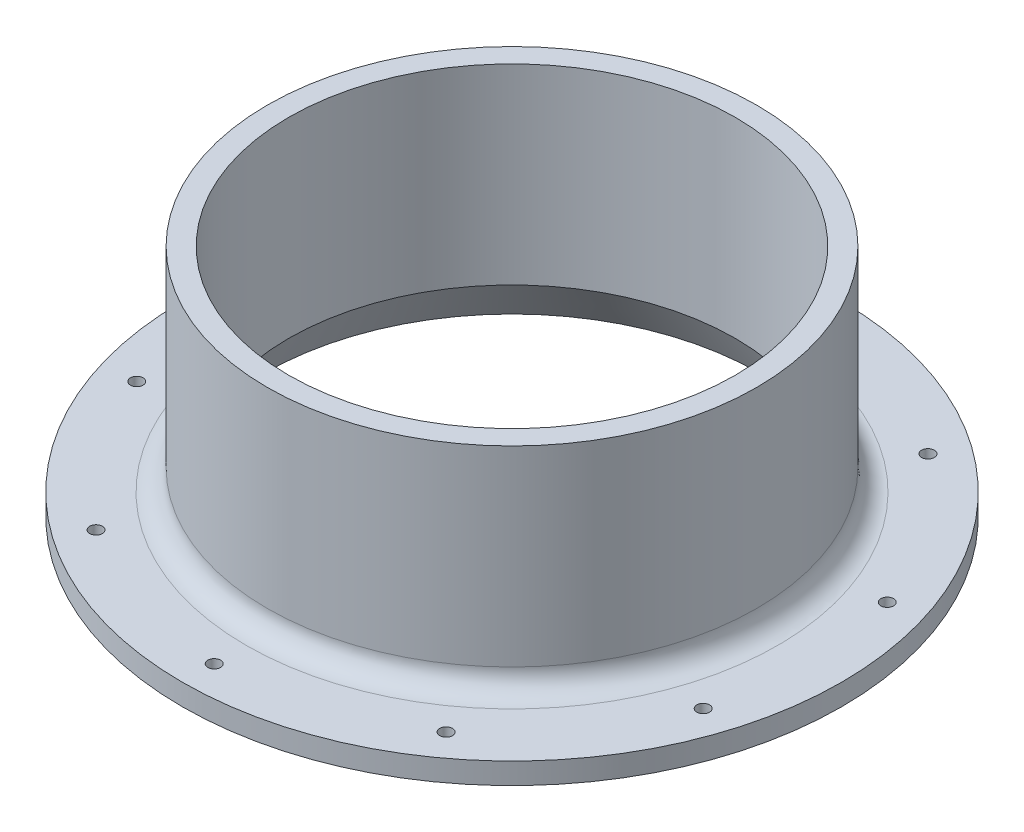
ISO-10303-21;
HEADER;
FILE_DESCRIPTION(('STEP AP214'),'2;1');
FILE_NAME('part.step','',(''),(''),'','','');
FILE_SCHEMA(('AUTOMOTIVE_DESIGN { 1 0 10303 214 1 1 1 1 }'));
ENDSEC;
DATA;
#1=APPLICATION_CONTEXT('core data for automotive mechanical design processes');
#2=APPLICATION_PROTOCOL_DEFINITION('international standard','automotive_design',2000,#1);
#3=PRODUCT_CONTEXT('',#1,'mechanical');
#4=PRODUCT('Part','Part','',(#3));
#5=PRODUCT_RELATED_PRODUCT_CATEGORY('part','',(#4));
#6=PRODUCT_DEFINITION_FORMATION('','',#4);
#7=PRODUCT_DEFINITION_CONTEXT('part definition',#1,'design');
#8=PRODUCT_DEFINITION('design','',#6,#7);
#9=PRODUCT_DEFINITION_SHAPE('','',#8);
#10=(LENGTH_UNIT() NAMED_UNIT(*) SI_UNIT(.MILLI.,.METRE.));
#11=(NAMED_UNIT(*) PLANE_ANGLE_UNIT() SI_UNIT($,.RADIAN.));
#12=(NAMED_UNIT(*) SI_UNIT($,.STERADIAN.) SOLID_ANGLE_UNIT());
#13=UNCERTAINTY_MEASURE_WITH_UNIT(LENGTH_MEASURE(1.E-05),#10,'distance_accuracy_value','');
#14=(GEOMETRIC_REPRESENTATION_CONTEXT(3) GLOBAL_UNCERTAINTY_ASSIGNED_CONTEXT((#13)) GLOBAL_UNIT_ASSIGNED_CONTEXT((#10,
#11,#12)) REPRESENTATION_CONTEXT('',''));
#15=CARTESIAN_POINT('',(0.,0.,0.));
#16=DIRECTION('',(0.,0.,1.));
#17=DIRECTION('',(1.,0.,0.));
#18=AXIS2_PLACEMENT_3D('',#15,#16,#17);
#19=CARTESIAN_POINT('',(0.,-6.35,0.));
#20=DIRECTION('',(0.,1.,0.));
#21=DIRECTION('',(0.,0.,1.));
#22=AXIS2_PLACEMENT_3D('',#19,#20,#21);
#23=CYLINDRICAL_SURFACE('',#22,98.425);
#24=CARTESIAN_POINT('',(0.,-6.35,0.));
#25=DIRECTION('',(0.,1.,0.));
#26=DIRECTION('',(0.,0.,1.));
#27=AXIS2_PLACEMENT_3D('',#24,#25,#26);
#28=CIRCLE('',#27,98.425);
#29=CARTESIAN_POINT('',(0.,-6.35,98.425));
#30=VERTEX_POINT('',#29);
#31=EDGE_CURVE('E123',#30,#30,#28,.T.);
#32=ORIENTED_EDGE('',*,*,#31,.T.);
#33=EDGE_LOOP('',(#32));
#34=FACE_BOUND('',#33,.T.);
#35=CARTESIAN_POINT('',(0.,0.,0.));
#36=DIRECTION('',(0.,1.,0.));
#37=DIRECTION('',(0.,0.,1.));
#38=AXIS2_PLACEMENT_3D('',#35,#36,#37);
#39=CIRCLE('',#38,98.425);
#40=CARTESIAN_POINT('',(0.,0.,98.425));
#41=VERTEX_POINT('',#40);
#42=EDGE_CURVE('E124',#41,#41,#39,.T.);
#43=ORIENTED_EDGE('',*,*,#42,.F.);
#44=EDGE_LOOP('',(#43));
#45=FACE_BOUND('',#44,.T.);
#46=ADVANCED_FACE('F42',(#34,#45),#23,.T.);
#47=CARTESIAN_POINT('',(0.,-6.35,0.));
#48=DIRECTION('',(0.,1.,0.));
#49=DIRECTION('',(0.,0.,1.));
#50=AXIS2_PLACEMENT_3D('',#47,#48,#49);
#51=CYLINDRICAL_SURFACE('',#50,66.675);
#52=CARTESIAN_POINT('',(0.,6.3500000000001,0.));
#53=DIRECTION('',(0.,1.,0.));
#54=DIRECTION('',(0.,0.,1.));
#55=AXIS2_PLACEMENT_3D('',#52,#53,#54);
#56=CIRCLE('',#55,66.675);
#57=CARTESIAN_POINT('',(0.,6.3500000000001,66.675));
#58=VERTEX_POINT('',#57);
#59=EDGE_CURVE('E10',#58,#58,#56,.F.);
#60=ORIENTED_EDGE('',*,*,#59,.T.);
#61=EDGE_LOOP('',(#60));
#62=FACE_BOUND('',#61,.T.);
#63=CARTESIAN_POINT('',(0.,63.5,0.));
#64=DIRECTION('',(0.,1.,0.));
#65=DIRECTION('',(0.,0.,1.));
#66=AXIS2_PLACEMENT_3D('',#63,#64,#65);
#67=CIRCLE('',#66,66.675);
#68=CARTESIAN_POINT('',(0.,63.5,66.675));
#69=VERTEX_POINT('',#68);
#70=EDGE_CURVE('E132',#69,#69,#67,.T.);
#71=ORIENTED_EDGE('',*,*,#70,.T.);
#72=EDGE_LOOP('',(#71));
#73=FACE_BOUND('',#72,.T.);
#74=ADVANCED_FACE('F184',(#62,#73),#51,.F.);
#75=CARTESIAN_POINT('',(0.,-6.35,0.));
#76=DIRECTION('',(0.,1.,0.));
#77=DIRECTION('',(0.,0.,1.));
#78=AXIS2_PLACEMENT_3D('',#75,#76,#77);
#79=PLANE('',#78);
#80=CARTESIAN_POINT('',(0.,-6.35,0.));
#81=DIRECTION('',(0.,1.,0.));
#82=DIRECTION('',(0.,0.,1.));
#83=AXIS2_PLACEMENT_3D('',#80,#81,#82);
#84=CIRCLE('',#83,74.0073484187082);
#85=CARTESIAN_POINT('',(0.,-6.35,74.0073484187082));
#86=VERTEX_POINT('',#85);
#87=EDGE_CURVE('E50',#86,#86,#84,.T.);
#88=ORIENTED_EDGE('',*,*,#87,.T.);
#89=EDGE_LOOP('',(#88));
#90=FACE_BOUND('',#89,.T.);
#91=CARTESIAN_POINT('',(52.2541089287999,-6.35,-71.9216107999335));
#92=DIRECTION('',(0.,1.,0.));
#93=DIRECTION('',(0.,0.,1.));
#94=AXIS2_PLACEMENT_3D('',#91,#92,#93);
#95=CIRCLE('',#94,3.93200000000001);
#96=CARTESIAN_POINT('',(52.2541089287999,-6.35,-67.9896107999335));
#97=VERTEX_POINT('',#96);
#98=EDGE_CURVE('E58',#97,#97,#95,.T.);
#99=ORIENTED_EDGE('',*,*,#98,.T.);
#100=EDGE_LOOP('',(#99));
#101=FACE_BOUND('',#100,.T.);
#102=CARTESIAN_POINT('',(84.5489242986388,-6.35,-27.4716107999338));
#103=DIRECTION('',(0.,1.,0.));
#104=DIRECTION('',(0.,0.,1.));
#105=AXIS2_PLACEMENT_3D('',#102,#103,#104);
#106=CIRCLE('',#105,3.93200000000003);
#107=CARTESIAN_POINT('',(84.5489242986388,-6.35,-23.5396107999337));
#108=VERTEX_POINT('',#107);
#109=EDGE_CURVE('E66',#108,#108,#106,.T.);
#110=ORIENTED_EDGE('',*,*,#109,.T.);
#111=EDGE_LOOP('',(#110));
#112=FACE_BOUND('',#111,.T.);
#113=CARTESIAN_POINT('',(84.5489242986394,-6.35,27.471610799932));
#114=DIRECTION('',(0.,1.,0.));
#115=DIRECTION('',(0.,0.,1.));
#116=AXIS2_PLACEMENT_3D('',#113,#114,#115);
#117=CIRCLE('',#116,3.93200000000004);
#118=CARTESIAN_POINT('',(84.5489242986394,-6.35,31.403610799932));
#119=VERTEX_POINT('',#118);
#120=EDGE_CURVE('E72',#119,#119,#117,.T.);
#121=ORIENTED_EDGE('',*,*,#120,.T.);
#122=EDGE_LOOP('',(#121));
#123=FACE_BOUND('',#122,.T.);
#124=CARTESIAN_POINT('',(52.2541089288015,-6.35,71.9216107999324));
#125=DIRECTION('',(0.,1.,0.));
#126=DIRECTION('',(0.,0.,1.));
#127=AXIS2_PLACEMENT_3D('',#124,#125,#126);
#128=CIRCLE('',#127,3.93200000000007);
#129=CARTESIAN_POINT('',(52.2541089288015,-6.35,75.8536107999324));
#130=VERTEX_POINT('',#129);
#131=EDGE_CURVE('E78',#130,#130,#128,.T.);
#132=ORIENTED_EDGE('',*,*,#131,.T.);
#133=EDGE_LOOP('',(#132));
#134=FACE_BOUND('',#133,.T.);
#135=CARTESIAN_POINT('',(0.,-6.35,88.9));
#136=DIRECTION('',(0.,1.,0.));
#137=DIRECTION('',(0.,0.,1.));
#138=AXIS2_PLACEMENT_3D('',#135,#136,#137);
#139=CIRCLE('',#138,3.93199999999999);
#140=CARTESIAN_POINT('',(0.,-6.35,92.832));
#141=VERTEX_POINT('',#140);
#142=EDGE_CURVE('E84',#141,#141,#139,.T.);
#143=ORIENTED_EDGE('',*,*,#142,.T.);
#144=EDGE_LOOP('',(#143));
#145=FACE_BOUND('',#144,.T.);
#146=CARTESIAN_POINT('',(-52.2541089288004,-6.35,71.9216107999331));
#147=DIRECTION('',(0.,1.,0.));
#148=DIRECTION('',(0.,0.,1.));
#149=AXIS2_PLACEMENT_3D('',#146,#147,#148);
#150=CIRCLE('',#149,3.932);
#151=CARTESIAN_POINT('',(-52.2541089288004,-6.35,75.8536107999331));
#152=VERTEX_POINT('',#151);
#153=EDGE_CURVE('E90',#152,#152,#150,.T.);
#154=ORIENTED_EDGE('',*,*,#153,.T.);
#155=EDGE_LOOP('',(#154));
#156=FACE_BOUND('',#155,.T.);
#157=CARTESIAN_POINT('',(-84.548924298639,-6.35,27.4716107999332));
#158=DIRECTION('',(0.,1.,0.));
#159=DIRECTION('',(0.,0.,1.));
#160=AXIS2_PLACEMENT_3D('',#157,#158,#159);
#161=CIRCLE('',#160,3.93200000000008);
#162=CARTESIAN_POINT('',(-84.548924298639,-6.35,31.4036107999333));
#163=VERTEX_POINT('',#162);
#164=EDGE_CURVE('E96',#163,#163,#161,.T.);
#165=ORIENTED_EDGE('',*,*,#164,.T.);
#166=EDGE_LOOP('',(#165));
#167=FACE_BOUND('',#166,.T.);
#168=CARTESIAN_POINT('',(-84.5489242986392,-6.35,-27.4716107999326));
#169=DIRECTION('',(0.,1.,0.));
#170=DIRECTION('',(0.,0.,1.));
#171=AXIS2_PLACEMENT_3D('',#168,#169,#170);
#172=CIRCLE('',#171,3.93200000000004);
#173=CARTESIAN_POINT('',(-84.5489242986392,-6.35,-23.5396107999325));
#174=VERTEX_POINT('',#173);
#175=EDGE_CURVE('E102',#174,#174,#172,.T.);
#176=ORIENTED_EDGE('',*,*,#175,.T.);
#177=EDGE_LOOP('',(#176));
#178=FACE_BOUND('',#177,.T.);
#179=CARTESIAN_POINT('',(-52.254108928801,-6.35,-71.9216107999328));
#180=DIRECTION('',(0.,1.,0.));
#181=DIRECTION('',(0.,0.,1.));
#182=AXIS2_PLACEMENT_3D('',#179,#180,#181);
#183=CIRCLE('',#182,3.93200000000003);
#184=CARTESIAN_POINT('',(-52.254108928801,-6.35,-67.9896107999327));
#185=VERTEX_POINT('',#184);
#186=EDGE_CURVE('E108',#185,#185,#183,.T.);
#187=ORIENTED_EDGE('',*,*,#186,.T.);
#188=EDGE_LOOP('',(#187));
#189=FACE_BOUND('',#188,.T.);
#190=CARTESIAN_POINT('',(0.,-6.35,-88.9));
#191=DIRECTION('',(0.,1.,0.));
#192=DIRECTION('',(0.,0.,1.));
#193=AXIS2_PLACEMENT_3D('',#190,#191,#192);
#194=CIRCLE('',#193,3.93199999999999);
#195=CARTESIAN_POINT('',(0.,-6.35,-84.968));
#196=VERTEX_POINT('',#195);
#197=EDGE_CURVE('E114',#196,#196,#194,.T.);
#198=ORIENTED_EDGE('',*,*,#197,.T.);
#199=EDGE_LOOP('',(#198));
#200=FACE_BOUND('',#199,.T.);
#201=ORIENTED_EDGE('',*,*,#31,.F.);
#202=EDGE_LOOP('',(#201));
#203=FACE_BOUND('',#202,.T.);
#204=ADVANCED_FACE('F172',(#90,#101,#112,#123,#134,#145,#156,#167,#178,#189,#200,#203),#79,.F.);
#205=CARTESIAN_POINT('',(0.,0.,0.));
#206=DIRECTION('',(0.,1.,0.));
#207=DIRECTION('',(0.,0.,1.));
#208=AXIS2_PLACEMENT_3D('',#205,#206,#207);
#209=PLANE('',#208);
#210=CARTESIAN_POINT('',(52.2541089287999,0.,-71.9216107999335));
#211=DIRECTION('',(0.,1.,0.));
#212=DIRECTION('',(-0.587785252292462,0.,0.809016994374955));
#213=AXIS2_PLACEMENT_3D('',#210,#211,#212);
#214=CIRCLE('',#213,1.9);
#215=CARTESIAN_POINT('',(51.1373169494442,0.,-70.3844785106211));
#216=VERTEX_POINT('',#215);
#217=EDGE_CURVE('E142',#216,#216,#214,.T.);
#218=ORIENTED_EDGE('',*,*,#217,.F.);
#219=EDGE_LOOP('',(#218));
#220=FACE_BOUND('',#219,.T.);
#221=CARTESIAN_POINT('',(84.5489242986388,0.,-27.4716107999338));
#222=DIRECTION('',(0.,1.,0.));
#223=DIRECTION('',(-0.95105651629515,0.,0.309016994374958));
#224=AXIS2_PLACEMENT_3D('',#221,#222,#223);
#225=CIRCLE('',#224,1.9);
#226=CARTESIAN_POINT('',(82.741916917678,0.,-26.8844785106214));
#227=VERTEX_POINT('',#226);
#228=EDGE_CURVE('E145',#227,#227,#225,.T.);
#229=ORIENTED_EDGE('',*,*,#228,.F.);
#230=EDGE_LOOP('',(#229));
#231=FACE_BOUND('',#230,.T.);
#232=CARTESIAN_POINT('',(84.5489242986394,0.,27.471610799932));
#233=DIRECTION('',(0.,1.,0.));
#234=DIRECTION('',(-0.951056516295157,0.,-0.309016994374938));
#235=AXIS2_PLACEMENT_3D('',#232,#233,#234);
#236=CIRCLE('',#235,1.9);
#237=CARTESIAN_POINT('',(82.7419169176786,0.,26.8844785106196));
#238=VERTEX_POINT('',#237);
#239=EDGE_CURVE('E148',#238,#238,#236,.T.);
#240=ORIENTED_EDGE('',*,*,#239,.F.);
#241=EDGE_LOOP('',(#240));
#242=FACE_BOUND('',#241,.T.);
#243=CARTESIAN_POINT('',(52.2541089288015,0.,71.9216107999324));
#244=DIRECTION('',(0.,1.,0.));
#245=DIRECTION('',(-0.58778525229248,0.,-0.809016994374942));
#246=AXIS2_PLACEMENT_3D('',#243,#244,#245);
#247=CIRCLE('',#246,1.9);
#248=CARTESIAN_POINT('',(51.1373169494458,0.,70.38447851062));
#249=VERTEX_POINT('',#248);
#250=EDGE_CURVE('E151',#249,#249,#247,.T.);
#251=ORIENTED_EDGE('',*,*,#250,.F.);
#252=EDGE_LOOP('',(#251));
#253=FACE_BOUND('',#252,.T.);
#254=CARTESIAN_POINT('',(0.,0.,88.9));
#255=DIRECTION('',(0.,1.,0.));
#256=DIRECTION('',(0.,0.,-1.));
#257=AXIS2_PLACEMENT_3D('',#254,#255,#256);
#258=CIRCLE('',#257,1.9);
#259=CARTESIAN_POINT('',(0.,0.,87.));
#260=VERTEX_POINT('',#259);
#261=EDGE_CURVE('E154',#260,#260,#258,.T.);
#262=ORIENTED_EDGE('',*,*,#261,.F.);
#263=EDGE_LOOP('',(#262));
#264=FACE_BOUND('',#263,.T.);
#265=CARTESIAN_POINT('',(-52.2541089288004,0.,71.9216107999331));
#266=DIRECTION('',(0.,1.,0.));
#267=DIRECTION('',(0.587785252292469,0.,-0.809016994374951));
#268=AXIS2_PLACEMENT_3D('',#265,#266,#267);
#269=CIRCLE('',#268,1.9);
#270=CARTESIAN_POINT('',(-51.1373169494448,0.,70.3844785106207));
#271=VERTEX_POINT('',#270);
#272=EDGE_CURVE('E157',#271,#271,#269,.T.);
#273=ORIENTED_EDGE('',*,*,#272,.F.);
#274=EDGE_LOOP('',(#273));
#275=FACE_BOUND('',#274,.T.);
#276=CARTESIAN_POINT('',(-84.548924298639,0.,27.4716107999332));
#277=DIRECTION('',(0.,1.,0.));
#278=DIRECTION('',(0.951056516295152,0.,-0.309016994374952));
#279=AXIS2_PLACEMENT_3D('',#276,#277,#278);
#280=CIRCLE('',#279,1.9);
#281=CARTESIAN_POINT('',(-82.7419169176782,0.,26.8844785106208));
#282=VERTEX_POINT('',#281);
#283=EDGE_CURVE('E160',#282,#282,#280,.T.);
#284=ORIENTED_EDGE('',*,*,#283,.F.);
#285=EDGE_LOOP('',(#284));
#286=FACE_BOUND('',#285,.T.);
#287=CARTESIAN_POINT('',(-84.5489242986392,0.,-27.4716107999326));
#288=DIRECTION('',(0.,1.,0.));
#289=DIRECTION('',(0.951056516295155,0.,0.309016994374945));
#290=AXIS2_PLACEMENT_3D('',#287,#288,#289);
#291=CIRCLE('',#290,1.9);
#292=CARTESIAN_POINT('',(-82.7419169176784,0.,-26.8844785106202));
#293=VERTEX_POINT('',#292);
#294=EDGE_CURVE('E141',#293,#293,#291,.T.);
#295=ORIENTED_EDGE('',*,*,#294,.F.);
#296=EDGE_LOOP('',(#295));
#297=FACE_BOUND('',#296,.T.);
#298=CARTESIAN_POINT('',(-52.254108928801,0.,-71.9216107999328));
#299=DIRECTION('',(0.,1.,0.));
#300=DIRECTION('',(0.587785252292474,0.,0.809016994374947));
#301=AXIS2_PLACEMENT_3D('',#298,#299,#300);
#302=CIRCLE('',#301,1.9);
#303=CARTESIAN_POINT('',(-51.1373169494453,0.,-70.3844785106204));
#304=VERTEX_POINT('',#303);
#305=EDGE_CURVE('E138',#304,#304,#302,.T.);
#306=ORIENTED_EDGE('',*,*,#305,.F.);
#307=EDGE_LOOP('',(#306));
#308=FACE_BOUND('',#307,.T.);
#309=CARTESIAN_POINT('',(0.,0.,-88.9));
#310=DIRECTION('',(0.,1.,0.));
#311=DIRECTION('',(0.,0.,1.));
#312=AXIS2_PLACEMENT_3D('',#309,#310,#311);
#313=CIRCLE('',#312,1.9);
#314=CARTESIAN_POINT('',(0.,0.,-87.));
#315=VERTEX_POINT('',#314);
#316=EDGE_CURVE('E135',#315,#315,#313,.T.);
#317=ORIENTED_EDGE('',*,*,#316,.F.);
#318=EDGE_LOOP('',(#317));
#319=FACE_BOUND('',#318,.T.);
#320=CARTESIAN_POINT('',(0.,0.,0.));
#321=DIRECTION('',(0.,1.,0.));
#322=DIRECTION('',(0.,0.,1.));
#323=AXIS2_PLACEMENT_3D('',#320,#321,#322);
#324=CIRCLE('',#323,79.375);
#325=CARTESIAN_POINT('',(0.,0.,79.375));
#326=VERTEX_POINT('',#325);
#327=EDGE_CURVE('E117',#326,#326,#324,.F.);
#328=ORIENTED_EDGE('',*,*,#327,.T.);
#329=EDGE_LOOP('',(#328));
#330=FACE_BOUND('',#329,.T.);
#331=ORIENTED_EDGE('',*,*,#42,.T.);
#332=EDGE_LOOP('',(#331));
#333=FACE_BOUND('',#332,.T.);
#334=ADVANCED_FACE('F168',(#220,#231,#242,#253,#264,#275,#286,#297,#308,#319,#330,#333),#209,.T.);
#335=CARTESIAN_POINT('',(0.,63.5,0.));
#336=DIRECTION('',(0.,-1.,0.));
#337=DIRECTION('',(0.,0.,-1.));
#338=AXIS2_PLACEMENT_3D('',#335,#336,#337);
#339=CYLINDRICAL_SURFACE('',#338,73.025);
#340=CARTESIAN_POINT('',(0.,6.35,0.));
#341=DIRECTION('',(0.,1.,0.));
#342=DIRECTION('',(0.,0.,1.));
#343=AXIS2_PLACEMENT_3D('',#340,#341,#342);
#344=CIRCLE('',#343,73.025);
#345=CARTESIAN_POINT('',(0.,6.35,73.025));
#346=VERTEX_POINT('',#345);
#347=EDGE_CURVE('E120',#346,#346,#344,.T.);
#348=ORIENTED_EDGE('',*,*,#347,.T.);
#349=EDGE_LOOP('',(#348));
#350=FACE_BOUND('',#349,.T.);
#351=CARTESIAN_POINT('',(0.,63.5,0.));
#352=DIRECTION('',(0.,1.,0.));
#353=DIRECTION('',(0.,0.,1.));
#354=AXIS2_PLACEMENT_3D('',#351,#352,#353);
#355=CIRCLE('',#354,73.025);
#356=CARTESIAN_POINT('',(0.,63.5,73.025));
#357=VERTEX_POINT('',#356);
#358=EDGE_CURVE('E127',#357,#357,#355,.T.);
#359=ORIENTED_EDGE('',*,*,#358,.F.);
#360=EDGE_LOOP('',(#359));
#361=FACE_BOUND('',#360,.T.);
#362=ADVANCED_FACE('F171',(#350,#361),#339,.T.);
#363=CARTESIAN_POINT('',(0.,63.5,0.));
#364=DIRECTION('',(0.,1.,0.));
#365=DIRECTION('',(0.,0.,1.));
#366=AXIS2_PLACEMENT_3D('',#363,#364,#365);
#367=PLANE('',#366);
#368=ORIENTED_EDGE('',*,*,#70,.F.);
#369=EDGE_LOOP('',(#368));
#370=FACE_BOUND('',#369,.T.);
#371=ORIENTED_EDGE('',*,*,#358,.T.);
#372=EDGE_LOOP('',(#371));
#373=FACE_BOUND('',#372,.T.);
#374=ADVANCED_FACE('F196',(#370,#373),#367,.T.);
#375=CARTESIAN_POINT('',(0.,6.35,0.));
#376=DIRECTION('',(0.,1.,0.));
#377=DIRECTION('',(0.,0.,1.));
#378=AXIS2_PLACEMENT_3D('',#375,#376,#377);
#379=TOROIDAL_SURFACE('',#378,79.375,6.35);
#380=ORIENTED_EDGE('',*,*,#327,.F.);
#381=EDGE_LOOP('',(#380));
#382=FACE_BOUND('',#381,.T.);
#383=ORIENTED_EDGE('',*,*,#347,.F.);
#384=EDGE_LOOP('',(#383));
#385=FACE_BOUND('',#384,.T.);
#386=ADVANCED_FACE('F192',(#382,#385),#379,.F.);
#387=CARTESIAN_POINT('',(0.,-6.35,-88.9));
#388=DIRECTION('',(0.,1.,0.));
#389=DIRECTION('',(0.,0.,1.));
#390=AXIS2_PLACEMENT_3D('',#387,#388,#389);
#391=CYLINDRICAL_SURFACE('',#390,1.9);
#392=CARTESIAN_POINT('',(0.,-4.31799999999997,-88.9));
#393=DIRECTION('',(0.,1.,0.));
#394=DIRECTION('',(0.,0.,1.));
#395=AXIS2_PLACEMENT_3D('',#392,#393,#394);
#396=CIRCLE('',#395,1.9);
#397=CARTESIAN_POINT('',(0.,-4.31799999999997,-87.));
#398=VERTEX_POINT('',#397);
#399=EDGE_CURVE('E111',#398,#398,#396,.F.);
#400=ORIENTED_EDGE('',*,*,#399,.T.);
#401=EDGE_LOOP('',(#400));
#402=FACE_BOUND('',#401,.T.);
#403=ORIENTED_EDGE('',*,*,#316,.T.);
#404=EDGE_LOOP('',(#403));
#405=FACE_BOUND('',#404,.T.);
#406=ADVANCED_FACE('F195',(#402,#405),#391,.F.);
#407=CARTESIAN_POINT('',(0.,-6.35,-88.9));
#408=DIRECTION('',(0.,-1.,0.));
#409=DIRECTION('',(0.,0.,-1.));
#410=AXIS2_PLACEMENT_3D('',#407,#408,#409);
#411=CONICAL_SURFACE('',#410,3.93199999999999,0.785398163397439);
#412=ORIENTED_EDGE('',*,*,#399,.F.);
#413=EDGE_LOOP('',(#412));
#414=FACE_BOUND('',#413,.T.);
#415=ORIENTED_EDGE('',*,*,#197,.F.);
#416=EDGE_LOOP('',(#415));
#417=FACE_BOUND('',#416,.T.);
#418=ADVANCED_FACE('F199',(#414,#417),#411,.F.);
#419=CARTESIAN_POINT('',(-52.254108928801,-6.35,-71.9216107999328));
#420=DIRECTION('',(0.,1.,0.));
#421=DIRECTION('',(0.,0.,1.));
#422=AXIS2_PLACEMENT_3D('',#419,#420,#421);
#423=CYLINDRICAL_SURFACE('',#422,1.9);
#424=CARTESIAN_POINT('',(-52.254108928801,-4.31799999999998,-71.9216107999328));
#425=DIRECTION('',(0.,1.,0.));
#426=DIRECTION('',(0.,0.,1.));
#427=AXIS2_PLACEMENT_3D('',#424,#425,#426);
#428=CIRCLE('',#427,1.9);
#429=CARTESIAN_POINT('',(-52.254108928801,-4.31799999999998,-70.0216107999328));
#430=VERTEX_POINT('',#429);
#431=EDGE_CURVE('E105',#430,#430,#428,.F.);
#432=ORIENTED_EDGE('',*,*,#431,.T.);
#433=EDGE_LOOP('',(#432));
#434=FACE_BOUND('',#433,.T.);
#435=ORIENTED_EDGE('',*,*,#305,.T.);
#436=EDGE_LOOP('',(#435));
#437=FACE_BOUND('',#436,.T.);
#438=ADVANCED_FACE('F205',(#434,#437),#423,.F.);
#439=CARTESIAN_POINT('',(-84.5489242986392,-6.35,-27.4716107999326));
#440=DIRECTION('',(0.,1.,0.));
#441=DIRECTION('',(0.,0.,1.));
#442=AXIS2_PLACEMENT_3D('',#439,#440,#441);
#443=CYLINDRICAL_SURFACE('',#442,1.9);
#444=CARTESIAN_POINT('',(-84.5489242986392,-4.31799999999998,-27.4716107999326));
#445=DIRECTION('',(0.,1.,0.));
#446=DIRECTION('',(0.,0.,1.));
#447=AXIS2_PLACEMENT_3D('',#444,#445,#446);
#448=CIRCLE('',#447,1.9);
#449=CARTESIAN_POINT('',(-84.5489242986392,-4.31799999999998,-25.5716107999326));
#450=VERTEX_POINT('',#449);
#451=EDGE_CURVE('E99',#450,#450,#448,.F.);
#452=ORIENTED_EDGE('',*,*,#451,.T.);
#453=EDGE_LOOP('',(#452));
#454=FACE_BOUND('',#453,.T.);
#455=ORIENTED_EDGE('',*,*,#294,.T.);
#456=EDGE_LOOP('',(#455));
#457=FACE_BOUND('',#456,.T.);
#458=ADVANCED_FACE('F166',(#454,#457),#443,.F.);
#459=CARTESIAN_POINT('',(-84.548924298639,-6.35,27.4716107999332));
#460=DIRECTION('',(0.,1.,0.));
#461=DIRECTION('',(0.,0.,1.));
#462=AXIS2_PLACEMENT_3D('',#459,#460,#461);
#463=CYLINDRICAL_SURFACE('',#462,1.9);
#464=CARTESIAN_POINT('',(-84.548924298639,-4.31799999999992,27.4716107999332));
#465=DIRECTION('',(0.,1.,0.));
#466=DIRECTION('',(0.,0.,1.));
#467=AXIS2_PLACEMENT_3D('',#464,#465,#466);
#468=CIRCLE('',#467,1.9);
#469=CARTESIAN_POINT('',(-84.548924298639,-4.31799999999992,29.3716107999332));
#470=VERTEX_POINT('',#469);
#471=EDGE_CURVE('E93',#470,#470,#468,.F.);
#472=ORIENTED_EDGE('',*,*,#471,.T.);
#473=EDGE_LOOP('',(#472));
#474=FACE_BOUND('',#473,.T.);
#475=ORIENTED_EDGE('',*,*,#283,.T.);
#476=EDGE_LOOP('',(#475));
#477=FACE_BOUND('',#476,.T.);
#478=ADVANCED_FACE('F344',(#474,#477),#463,.F.);
#479=CARTESIAN_POINT('',(-52.2541089288004,-6.35,71.9216107999331));
#480=DIRECTION('',(0.,1.,0.));
#481=DIRECTION('',(0.,0.,1.));
#482=AXIS2_PLACEMENT_3D('',#479,#480,#481);
#483=CYLINDRICAL_SURFACE('',#482,1.9);
#484=CARTESIAN_POINT('',(-52.2541089288004,-4.318,71.9216107999331));
#485=DIRECTION('',(0.,1.,0.));
#486=DIRECTION('',(0.,0.,1.));
#487=AXIS2_PLACEMENT_3D('',#484,#485,#486);
#488=CIRCLE('',#487,1.9);
#489=CARTESIAN_POINT('',(-52.2541089288004,-4.318,73.8216107999331));
#490=VERTEX_POINT('',#489);
#491=EDGE_CURVE('E87',#490,#490,#488,.F.);
#492=ORIENTED_EDGE('',*,*,#491,.T.);
#493=EDGE_LOOP('',(#492));
#494=FACE_BOUND('',#493,.T.);
#495=ORIENTED_EDGE('',*,*,#272,.T.);
#496=EDGE_LOOP('',(#495));
#497=FACE_BOUND('',#496,.T.);
#498=ADVANCED_FACE('F340',(#494,#497),#483,.F.);
#499=CARTESIAN_POINT('',(0.,-6.35,88.9));
#500=DIRECTION('',(0.,1.,0.));
#501=DIRECTION('',(0.,0.,1.));
#502=AXIS2_PLACEMENT_3D('',#499,#500,#501);
#503=CYLINDRICAL_SURFACE('',#502,1.9);
#504=CARTESIAN_POINT('',(0.,-4.31799999999997,88.9));
#505=DIRECTION('',(0.,1.,0.));
#506=DIRECTION('',(0.,0.,1.));
#507=AXIS2_PLACEMENT_3D('',#504,#505,#506);
#508=CIRCLE('',#507,1.9);
#509=CARTESIAN_POINT('',(0.,-4.31799999999997,90.8));
#510=VERTEX_POINT('',#509);
#511=EDGE_CURVE('E81',#510,#510,#508,.F.);
#512=ORIENTED_EDGE('',*,*,#511,.T.);
#513=EDGE_LOOP('',(#512));
#514=FACE_BOUND('',#513,.T.);
#515=ORIENTED_EDGE('',*,*,#261,.T.);
#516=EDGE_LOOP('',(#515));
#517=FACE_BOUND('',#516,.T.);
#518=ADVANCED_FACE('F336',(#514,#517),#503,.F.);
#519=CARTESIAN_POINT('',(52.2541089288015,-6.35,71.9216107999324));
#520=DIRECTION('',(0.,1.,0.));
#521=DIRECTION('',(0.,0.,1.));
#522=AXIS2_PLACEMENT_3D('',#519,#520,#521);
#523=CYLINDRICAL_SURFACE('',#522,1.9);
#524=CARTESIAN_POINT('',(52.2541089288015,-4.31799999999995,71.9216107999324));
#525=DIRECTION('',(0.,1.,0.));
#526=DIRECTION('',(0.,0.,1.));
#527=AXIS2_PLACEMENT_3D('',#524,#525,#526);
#528=CIRCLE('',#527,1.9);
#529=CARTESIAN_POINT('',(52.2541089288015,-4.31799999999995,73.8216107999324));
#530=VERTEX_POINT('',#529);
#531=EDGE_CURVE('E75',#530,#530,#528,.F.);
#532=ORIENTED_EDGE('',*,*,#531,.T.);
#533=EDGE_LOOP('',(#532));
#534=FACE_BOUND('',#533,.T.);
#535=ORIENTED_EDGE('',*,*,#250,.T.);
#536=EDGE_LOOP('',(#535));
#537=FACE_BOUND('',#536,.T.);
#538=ADVANCED_FACE('F332',(#534,#537),#523,.F.);
#539=CARTESIAN_POINT('',(84.5489242986394,-6.35,27.471610799932));
#540=DIRECTION('',(0.,1.,0.));
#541=DIRECTION('',(0.,0.,1.));
#542=AXIS2_PLACEMENT_3D('',#539,#540,#541);
#543=CYLINDRICAL_SURFACE('',#542,1.9);
#544=CARTESIAN_POINT('',(84.5489242986394,-4.31799999999994,27.471610799932));
#545=DIRECTION('',(0.,1.,0.));
#546=DIRECTION('',(0.,0.,1.));
#547=AXIS2_PLACEMENT_3D('',#544,#545,#546);
#548=CIRCLE('',#547,1.9);
#549=CARTESIAN_POINT('',(84.5489242986394,-4.31799999999994,29.371610799932));
#550=VERTEX_POINT('',#549);
#551=EDGE_CURVE('E69',#550,#550,#548,.F.);
#552=ORIENTED_EDGE('',*,*,#551,.T.);
#553=EDGE_LOOP('',(#552));
#554=FACE_BOUND('',#553,.T.);
#555=ORIENTED_EDGE('',*,*,#239,.T.);
#556=EDGE_LOOP('',(#555));
#557=FACE_BOUND('',#556,.T.);
#558=ADVANCED_FACE('F328',(#554,#557),#543,.F.);
#559=CARTESIAN_POINT('',(84.5489242986388,-6.35,-27.4716107999338));
#560=DIRECTION('',(0.,1.,0.));
#561=DIRECTION('',(0.,0.,1.));
#562=AXIS2_PLACEMENT_3D('',#559,#560,#561);
#563=CYLINDRICAL_SURFACE('',#562,1.9);
#564=CARTESIAN_POINT('',(84.5489242986388,-4.31799999999998,-27.4716107999338));
#565=DIRECTION('',(0.,1.,0.));
#566=DIRECTION('',(0.,0.,1.));
#567=AXIS2_PLACEMENT_3D('',#564,#565,#566);
#568=CIRCLE('',#567,1.9);
#569=CARTESIAN_POINT('',(84.5489242986388,-4.31799999999998,-25.5716107999338));
#570=VERTEX_POINT('',#569);
#571=EDGE_CURVE('E63',#570,#570,#568,.F.);
#572=ORIENTED_EDGE('',*,*,#571,.T.);
#573=EDGE_LOOP('',(#572));
#574=FACE_BOUND('',#573,.T.);
#575=ORIENTED_EDGE('',*,*,#228,.T.);
#576=EDGE_LOOP('',(#575));
#577=FACE_BOUND('',#576,.T.);
#578=ADVANCED_FACE('F324',(#574,#577),#563,.F.);
#579=CARTESIAN_POINT('',(52.2541089287999,-6.35,-71.9216107999335));
#580=DIRECTION('',(0.,1.,0.));
#581=DIRECTION('',(0.,0.,1.));
#582=AXIS2_PLACEMENT_3D('',#579,#580,#581);
#583=CYLINDRICAL_SURFACE('',#582,1.9);
#584=CARTESIAN_POINT('',(52.2541089287999,-4.31799999999998,-71.9216107999335));
#585=DIRECTION('',(0.,1.,0.));
#586=DIRECTION('',(0.,0.,1.));
#587=AXIS2_PLACEMENT_3D('',#584,#585,#586);
#588=CIRCLE('',#587,1.9);
#589=CARTESIAN_POINT('',(52.2541089287999,-4.31799999999998,-70.0216107999335));
#590=VERTEX_POINT('',#589);
#591=EDGE_CURVE('E54',#590,#590,#588,.F.);
#592=ORIENTED_EDGE('',*,*,#591,.T.);
#593=EDGE_LOOP('',(#592));
#594=FACE_BOUND('',#593,.T.);
#595=ORIENTED_EDGE('',*,*,#217,.T.);
#596=EDGE_LOOP('',(#595));
#597=FACE_BOUND('',#596,.T.);
#598=ADVANCED_FACE('F214',(#594,#597),#583,.F.);
#599=CARTESIAN_POINT('',(-52.254108928801,-6.35,-71.9216107999328));
#600=DIRECTION('',(0.,-1.,0.));
#601=DIRECTION('',(0.,0.,-1.));
#602=AXIS2_PLACEMENT_3D('',#599,#600,#601);
#603=CONICAL_SURFACE('',#602,3.93200000000002,0.78539816339745);
#604=ORIENTED_EDGE('',*,*,#431,.F.);
#605=EDGE_LOOP('',(#604));
#606=FACE_BOUND('',#605,.T.);
#607=ORIENTED_EDGE('',*,*,#186,.F.);
#608=EDGE_LOOP('',(#607));
#609=FACE_BOUND('',#608,.T.);
#610=ADVANCED_FACE('F207',(#606,#609),#603,.F.);
#611=CARTESIAN_POINT('',(-84.5489242986392,-6.35,-27.4716107999326));
#612=DIRECTION('',(0.,-1.,0.));
#613=DIRECTION('',(0.,0.,-1.));
#614=AXIS2_PLACEMENT_3D('',#611,#612,#613);
#615=CONICAL_SURFACE('',#614,3.93200000000004,0.785398163397453);
#616=ORIENTED_EDGE('',*,*,#451,.F.);
#617=EDGE_LOOP('',(#616));
#618=FACE_BOUND('',#617,.T.);
#619=ORIENTED_EDGE('',*,*,#175,.F.);
#620=EDGE_LOOP('',(#619));
#621=FACE_BOUND('',#620,.T.);
#622=ADVANCED_FACE('F213',(#618,#621),#615,.F.);
#623=CARTESIAN_POINT('',(-84.548924298639,-6.35,27.4716107999332));
#624=DIRECTION('',(0.,-1.,0.));
#625=DIRECTION('',(0.,0.,-1.));
#626=AXIS2_PLACEMENT_3D('',#623,#624,#625);
#627=CONICAL_SURFACE('',#626,3.93200000000008,0.785398163397449);
#628=ORIENTED_EDGE('',*,*,#471,.F.);
#629=EDGE_LOOP('',(#628));
#630=FACE_BOUND('',#629,.T.);
#631=ORIENTED_EDGE('',*,*,#164,.F.);
#632=EDGE_LOOP('',(#631));
#633=FACE_BOUND('',#632,.T.);
#634=ADVANCED_FACE('F221',(#630,#633),#627,.F.);
#635=CARTESIAN_POINT('',(-52.2541089288004,-6.35,71.9216107999331));
#636=DIRECTION('',(0.,-1.,0.));
#637=DIRECTION('',(0.,0.,-1.));
#638=AXIS2_PLACEMENT_3D('',#635,#636,#637);
#639=CONICAL_SURFACE('',#638,3.932,0.785398163397447);
#640=ORIENTED_EDGE('',*,*,#491,.F.);
#641=EDGE_LOOP('',(#640));
#642=FACE_BOUND('',#641,.T.);
#643=ORIENTED_EDGE('',*,*,#153,.F.);
#644=EDGE_LOOP('',(#643));
#645=FACE_BOUND('',#644,.T.);
#646=ADVANCED_FACE('F228',(#642,#645),#639,.F.);
#647=CARTESIAN_POINT('',(0.,-6.35,88.9));
#648=DIRECTION('',(0.,-1.,0.));
#649=DIRECTION('',(0.,0.,-1.));
#650=AXIS2_PLACEMENT_3D('',#647,#648,#649);
#651=CONICAL_SURFACE('',#650,3.93199999999999,0.785398163397439);
#652=ORIENTED_EDGE('',*,*,#511,.F.);
#653=EDGE_LOOP('',(#652));
#654=FACE_BOUND('',#653,.T.);
#655=ORIENTED_EDGE('',*,*,#142,.F.);
#656=EDGE_LOOP('',(#655));
#657=FACE_BOUND('',#656,.T.);
#658=ADVANCED_FACE('F235',(#654,#657),#651,.F.);
#659=CARTESIAN_POINT('',(52.2541089288015,-6.35,71.9216107999324));
#660=DIRECTION('',(0.,-1.,0.));
#661=DIRECTION('',(0.,0.,-1.));
#662=AXIS2_PLACEMENT_3D('',#659,#660,#661);
#663=CONICAL_SURFACE('',#662,3.93200000000007,0.785398163397453);
#664=ORIENTED_EDGE('',*,*,#531,.F.);
#665=EDGE_LOOP('',(#664));
#666=FACE_BOUND('',#665,.T.);
#667=ORIENTED_EDGE('',*,*,#131,.F.);
#668=EDGE_LOOP('',(#667));
#669=FACE_BOUND('',#668,.T.);
#670=ADVANCED_FACE('F242',(#666,#669),#663,.F.);
#671=CARTESIAN_POINT('',(84.5489242986394,-6.35,27.471610799932));
#672=DIRECTION('',(0.,-1.,0.));
#673=DIRECTION('',(0.,0.,-1.));
#674=AXIS2_PLACEMENT_3D('',#671,#672,#673);
#675=CONICAL_SURFACE('',#674,3.93200000000004,0.785398163397443);
#676=ORIENTED_EDGE('',*,*,#551,.F.);
#677=EDGE_LOOP('',(#676));
#678=FACE_BOUND('',#677,.T.);
#679=ORIENTED_EDGE('',*,*,#120,.F.);
#680=EDGE_LOOP('',(#679));
#681=FACE_BOUND('',#680,.T.);
#682=ADVANCED_FACE('F249',(#678,#681),#675,.F.);
#683=CARTESIAN_POINT('',(84.5489242986388,-6.35,-27.4716107999338));
#684=DIRECTION('',(0.,-1.,0.));
#685=DIRECTION('',(0.,0.,-1.));
#686=AXIS2_PLACEMENT_3D('',#683,#684,#685);
#687=CONICAL_SURFACE('',#686,3.93200000000003,0.78539816339745);
#688=ORIENTED_EDGE('',*,*,#571,.F.);
#689=EDGE_LOOP('',(#688));
#690=FACE_BOUND('',#689,.T.);
#691=ORIENTED_EDGE('',*,*,#109,.F.);
#692=EDGE_LOOP('',(#691));
#693=FACE_BOUND('',#692,.T.);
#694=ADVANCED_FACE('F256',(#690,#693),#687,.F.);
#695=CARTESIAN_POINT('',(52.2541089287999,-6.35,-71.9216107999335));
#696=DIRECTION('',(0.,-1.,0.));
#697=DIRECTION('',(0.,0.,-1.));
#698=AXIS2_PLACEMENT_3D('',#695,#696,#697);
#699=CONICAL_SURFACE('',#698,3.93200000000001,0.785398163397446);
#700=ORIENTED_EDGE('',*,*,#591,.F.);
#701=EDGE_LOOP('',(#700));
#702=FACE_BOUND('',#701,.T.);
#703=ORIENTED_EDGE('',*,*,#98,.F.);
#704=EDGE_LOOP('',(#703));
#705=FACE_BOUND('',#704,.T.);
#706=ADVANCED_FACE('F262',(#702,#705),#699,.F.);
#707=CARTESIAN_POINT('',(0.,-6.35,0.));
#708=DIRECTION('',(0.,-1.,0.));
#709=DIRECTION('',(0.,0.,-1.));
#710=AXIS2_PLACEMENT_3D('',#707,#708,#709);
#711=CONICAL_SURFACE('',#710,74.0073484187082,0.523598775598296);
#712=ORIENTED_EDGE('',*,*,#59,.F.);
#713=EDGE_LOOP('',(#712));
#714=FACE_BOUND('',#713,.T.);
#715=ORIENTED_EDGE('',*,*,#87,.F.);
#716=EDGE_LOOP('',(#715));
#717=FACE_BOUND('',#716,.T.);
#718=ADVANCED_FACE('F45',(#714,#717),#711,.F.);
#719=CLOSED_SHELL('',(#46,#74,#204,#334,#362,#374,#386,#406,#418,#438,#458,#478,#498,#518,#538,
#558,#578,#598,#610,#622,#634,#646,#658,#670,#682,#694,#706,#718));
#720=MANIFOLD_SOLID_BREP('B2',#719);
#721=ADVANCED_BREP_SHAPE_REPRESENTATION('',(#18,#720),#14);
#722=SHAPE_DEFINITION_REPRESENTATION(#9,#721);
ENDSEC;
END-ISO-10303-21;
